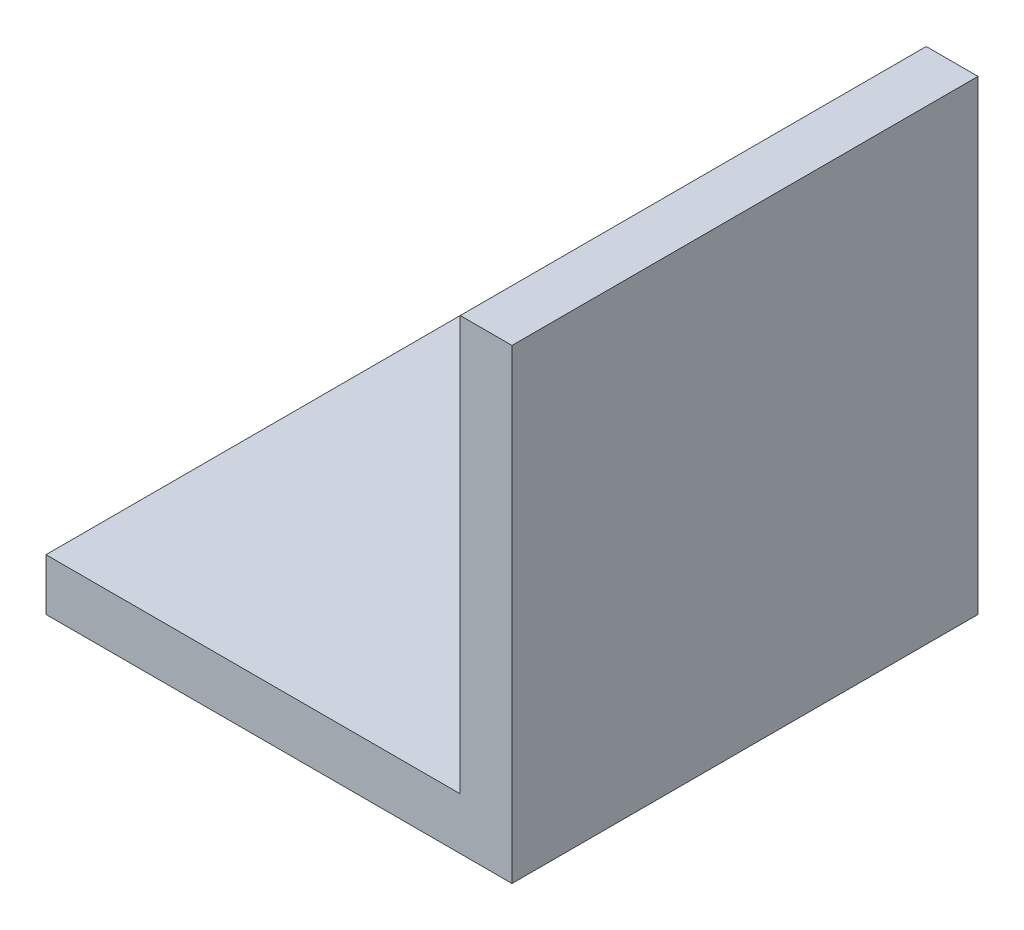
ISO-10303-21;
HEADER;
FILE_DESCRIPTION(('STEP AP214'),'2;1');
FILE_NAME('part.step','',(''),(''),'','','');
FILE_SCHEMA(('AUTOMOTIVE_DESIGN { 1 0 10303 214 1 1 1 1 }'));
ENDSEC;
DATA;
#1=APPLICATION_CONTEXT('core data for automotive mechanical design processes');
#2=APPLICATION_PROTOCOL_DEFINITION('international standard','automotive_design',2000,#1);
#3=PRODUCT_CONTEXT('',#1,'mechanical');
#4=PRODUCT('Part','Part','',(#3));
#5=PRODUCT_RELATED_PRODUCT_CATEGORY('part','',(#4));
#6=PRODUCT_DEFINITION_FORMATION('','',#4);
#7=PRODUCT_DEFINITION_CONTEXT('part definition',#1,'design');
#8=PRODUCT_DEFINITION('design','',#6,#7);
#9=PRODUCT_DEFINITION_SHAPE('','',#8);
#10=(LENGTH_UNIT() NAMED_UNIT(*) SI_UNIT(.MILLI.,.METRE.));
#11=(NAMED_UNIT(*) PLANE_ANGLE_UNIT() SI_UNIT($,.RADIAN.));
#12=(NAMED_UNIT(*) SI_UNIT($,.STERADIAN.) SOLID_ANGLE_UNIT());
#13=UNCERTAINTY_MEASURE_WITH_UNIT(LENGTH_MEASURE(1.E-05),#10,'distance_accuracy_value','');
#14=(GEOMETRIC_REPRESENTATION_CONTEXT(3) GLOBAL_UNCERTAINTY_ASSIGNED_CONTEXT((#13)) GLOBAL_UNIT_ASSIGNED_CONTEXT((#10,
#11,#12)) REPRESENTATION_CONTEXT('',''));
#15=CARTESIAN_POINT('',(0.,0.,0.));
#16=DIRECTION('',(0.,0.,1.));
#17=DIRECTION('',(1.,0.,0.));
#18=AXIS2_PLACEMENT_3D('',#15,#16,#17);
#19=CARTESIAN_POINT('',(-49.4298764435396,8.46666582,37.5879032258064));
#20=DIRECTION('',(1.,0.,0.));
#21=DIRECTION('',(0.,0.,-1.));
#22=AXIS2_PLACEMENT_3D('',#19,#20,#21);
#23=PLANE('',#22);
#24=DIRECTION('',(0.,0.,1.));
#25=VECTOR('',#24,1.);
#26=CARTESIAN_POINT('',(-49.4298764435396,0.,37.5879032258064));
#27=LINE('',#26,#25);
#28=CARTESIAN_POINT('',(-49.4298764435396,0.,-38.6120967741935));
#29=VERTEX_POINT('',#28);
#30=CARTESIAN_POINT('',(-49.4298764435396,0.,37.5879032258064));
#31=VERTEX_POINT('',#30);
#32=EDGE_CURVE('E113',#29,#31,#27,.T.);
#33=ORIENTED_EDGE('',*,*,#32,.T.);
#34=DIRECTION('',(0.,-1.,0.));
#35=VECTOR('',#34,1.);
#36=CARTESIAN_POINT('',(-49.4298764435396,8.46666582,37.5879032258064));
#37=LINE('',#36,#35);
#38=CARTESIAN_POINT('',(-49.4298764435396,8.46666582,37.5879032258064));
#39=VERTEX_POINT('',#38);
#40=EDGE_CURVE('E11',#39,#31,#37,.T.);
#41=ORIENTED_EDGE('',*,*,#40,.F.);
#42=DIRECTION('',(0.,0.,1.));
#43=VECTOR('',#42,1.);
#44=CARTESIAN_POINT('',(-49.4298764435396,8.46666582,37.5879032258064));
#45=LINE('',#44,#43);
#46=CARTESIAN_POINT('',(-49.4298764435396,8.46666582,-38.6120967741935));
#47=VERTEX_POINT('',#46);
#48=EDGE_CURVE('E114',#47,#39,#45,.T.);
#49=ORIENTED_EDGE('',*,*,#48,.F.);
#50=DIRECTION('',(0.,-1.,0.));
#51=VECTOR('',#50,1.);
#52=CARTESIAN_POINT('',(-49.4298764435396,8.46666582,-38.6120967741935));
#53=LINE('',#52,#51);
#54=EDGE_CURVE('E119',#47,#29,#53,.T.);
#55=ORIENTED_EDGE('',*,*,#54,.T.);
#56=EDGE_LOOP('',(#33,#41,#49,#55));
#57=FACE_BOUND('',#56,.T.);
#58=ADVANCED_FACE('F33',(#57),#23,.F.);
#59=CARTESIAN_POINT('',(-49.4298764435396,8.46666582,37.5879032258064));
#60=DIRECTION('',(0.,0.,-1.));
#61=DIRECTION('',(-1.,0.,0.));
#62=AXIS2_PLACEMENT_3D('',#59,#60,#61);
#63=PLANE('',#62);
#64=DIRECTION('',(1.,0.,0.));
#65=VECTOR('',#64,1.);
#66=CARTESIAN_POINT('',(-49.4298764435396,0.,37.5879032258064));
#67=LINE('',#66,#65);
#68=CARTESIAN_POINT('',(26.7701235564604,0.,37.5879032258065));
#69=VERTEX_POINT('',#68);
#70=EDGE_CURVE('E122',#31,#69,#67,.T.);
#71=ORIENTED_EDGE('',*,*,#70,.T.);
#72=DIRECTION('',(0.,-1.,0.));
#73=VECTOR('',#72,1.);
#74=CARTESIAN_POINT('',(26.7701235564604,8.46666582,37.5879032258065));
#75=LINE('',#74,#73);
#76=CARTESIAN_POINT('',(26.7701235564604,76.2,37.5879032258065));
#77=VERTEX_POINT('',#76);
#78=EDGE_CURVE('E40',#77,#69,#75,.T.);
#79=ORIENTED_EDGE('',*,*,#78,.F.);
#80=DIRECTION('',(1.,0.,0.));
#81=VECTOR('',#80,1.);
#82=CARTESIAN_POINT('',(18.3034568897937,76.2,37.5879032258065));
#83=LINE('',#82,#81);
#84=CARTESIAN_POINT('',(18.3034568897937,76.2,37.5879032258065));
#85=VERTEX_POINT('',#84);
#86=EDGE_CURVE('E102',#85,#77,#83,.T.);
#87=ORIENTED_EDGE('',*,*,#86,.F.);
#88=DIRECTION('',(0.,-1.,0.));
#89=VECTOR('',#88,1.);
#90=CARTESIAN_POINT('',(18.3034568897937,0.,37.5879032258065));
#91=LINE('',#90,#89);
#92=CARTESIAN_POINT('',(18.3034568897937,8.46666582,37.5879032258065));
#93=VERTEX_POINT('',#92);
#94=EDGE_CURVE('E94',#85,#93,#91,.T.);
#95=ORIENTED_EDGE('',*,*,#94,.T.);
#96=DIRECTION('',(1.,0.,0.));
#97=VECTOR('',#96,1.);
#98=CARTESIAN_POINT('',(-49.4298764435396,8.46666582,37.5879032258064));
#99=LINE('',#98,#97);
#100=EDGE_CURVE('E52',#39,#93,#99,.T.);
#101=ORIENTED_EDGE('',*,*,#100,.F.);
#102=ORIENTED_EDGE('',*,*,#40,.T.);
#103=EDGE_LOOP('',(#71,#79,#87,#95,#101,#102));
#104=FACE_BOUND('',#103,.T.);
#105=ADVANCED_FACE('F153',(#104),#63,.F.);
#106=CARTESIAN_POINT('',(26.7701235564604,8.46666582,37.5879032258065));
#107=DIRECTION('',(-1.,0.,0.));
#108=DIRECTION('',(0.,0.,1.));
#109=AXIS2_PLACEMENT_3D('',#106,#107,#108);
#110=PLANE('',#109);
#111=DIRECTION('',(0.,0.,-1.));
#112=VECTOR('',#111,1.);
#113=CARTESIAN_POINT('',(26.7701235564604,0.,37.5879032258065));
#114=LINE('',#113,#112);
#115=CARTESIAN_POINT('',(26.7701235564604,0.,-38.6120967741935));
#116=VERTEX_POINT('',#115);
#117=EDGE_CURVE('E124',#69,#116,#114,.T.);
#118=ORIENTED_EDGE('',*,*,#117,.T.);
#119=DIRECTION('',(0.,-1.,0.));
#120=VECTOR('',#119,1.);
#121=CARTESIAN_POINT('',(26.7701235564604,8.46666582,-38.6120967741935));
#122=LINE('',#121,#120);
#123=CARTESIAN_POINT('',(26.7701235564604,76.2,-38.6120967741935));
#124=VERTEX_POINT('',#123);
#125=EDGE_CURVE('E129',#124,#116,#122,.T.);
#126=ORIENTED_EDGE('',*,*,#125,.F.);
#127=DIRECTION('',(0.,0.,1.));
#128=VECTOR('',#127,1.);
#129=CARTESIAN_POINT('',(26.7701235564604,76.2,37.5879032258065));
#130=LINE('',#129,#128);
#131=EDGE_CURVE('E101',#124,#77,#130,.T.);
#132=ORIENTED_EDGE('',*,*,#131,.T.);
#133=ORIENTED_EDGE('',*,*,#78,.T.);
#134=EDGE_LOOP('',(#118,#126,#132,#133));
#135=FACE_BOUND('',#134,.T.);
#136=ADVANCED_FACE('F133',(#135),#110,.F.);
#137=CARTESIAN_POINT('',(-49.4298764435396,8.46666582,-38.6120967741935));
#138=DIRECTION('',(0.,0.,1.));
#139=DIRECTION('',(1.,0.,0.));
#140=AXIS2_PLACEMENT_3D('',#137,#138,#139);
#141=PLANE('',#140);
#142=DIRECTION('',(-1.,0.,0.));
#143=VECTOR('',#142,1.);
#144=CARTESIAN_POINT('',(-49.4298764435396,8.46666582,-38.6120967741935));
#145=LINE('',#144,#143);
#146=CARTESIAN_POINT('',(18.3034568897937,8.46666582,-38.6120967741935));
#147=VERTEX_POINT('',#146);
#148=EDGE_CURVE('E90',#147,#47,#145,.T.);
#149=ORIENTED_EDGE('',*,*,#148,.F.);
#150=DIRECTION('',(0.,1.,0.));
#151=VECTOR('',#150,1.);
#152=CARTESIAN_POINT('',(18.3034568897937,0.,-38.6120967741935));
#153=LINE('',#152,#151);
#154=CARTESIAN_POINT('',(18.3034568897937,76.2,-38.6120967741935));
#155=VERTEX_POINT('',#154);
#156=EDGE_CURVE('E83',#147,#155,#153,.T.);
#157=ORIENTED_EDGE('',*,*,#156,.T.);
#158=DIRECTION('',(1.,0.,0.));
#159=VECTOR('',#158,1.);
#160=CARTESIAN_POINT('',(18.3034568897937,76.2,-38.6120967741935));
#161=LINE('',#160,#159);
#162=EDGE_CURVE('E87',#155,#124,#161,.T.);
#163=ORIENTED_EDGE('',*,*,#162,.T.);
#164=ORIENTED_EDGE('',*,*,#125,.T.);
#165=DIRECTION('',(-1.,0.,0.));
#166=VECTOR('',#165,1.);
#167=CARTESIAN_POINT('',(-49.4298764435396,0.,-38.6120967741935));
#168=LINE('',#167,#166);
#169=EDGE_CURVE('E116',#116,#29,#168,.T.);
#170=ORIENTED_EDGE('',*,*,#169,.T.);
#171=ORIENTED_EDGE('',*,*,#54,.F.);
#172=EDGE_LOOP('',(#149,#157,#163,#164,#170,#171));
#173=FACE_BOUND('',#172,.T.);
#174=ADVANCED_FACE('F85',(#173),#141,.F.);
#175=CARTESIAN_POINT('',(0.,8.46666582,0.));
#176=DIRECTION('',(0.,-1.,0.));
#177=DIRECTION('',(0.,0.,-1.));
#178=AXIS2_PLACEMENT_3D('',#175,#176,#177);
#179=PLANE('',#178);
#180=ORIENTED_EDGE('',*,*,#100,.T.);
#181=DIRECTION('',(0.,0.,-1.));
#182=VECTOR('',#181,1.);
#183=CARTESIAN_POINT('',(18.3034568897937,8.46666582,0.));
#184=LINE('',#183,#182);
#185=EDGE_CURVE('E47',#93,#147,#184,.T.);
#186=ORIENTED_EDGE('',*,*,#185,.T.);
#187=ORIENTED_EDGE('',*,*,#148,.T.);
#188=ORIENTED_EDGE('',*,*,#48,.T.);
#189=EDGE_LOOP('',(#180,#186,#187,#188));
#190=FACE_BOUND('',#189,.T.);
#191=ADVANCED_FACE('F142',(#190),#179,.F.);
#192=CARTESIAN_POINT('',(0.,0.,0.));
#193=DIRECTION('',(0.,-1.,0.));
#194=DIRECTION('',(0.,0.,-1.));
#195=AXIS2_PLACEMENT_3D('',#192,#193,#194);
#196=PLANE('',#195);
#197=ORIENTED_EDGE('',*,*,#32,.F.);
#198=ORIENTED_EDGE('',*,*,#169,.F.);
#199=ORIENTED_EDGE('',*,*,#117,.F.);
#200=ORIENTED_EDGE('',*,*,#70,.F.);
#201=EDGE_LOOP('',(#197,#198,#199,#200));
#202=FACE_BOUND('',#201,.T.);
#203=ADVANCED_FACE('F138',(#202),#196,.T.);
#204=CARTESIAN_POINT('',(18.3034568897937,0.,0.));
#205=DIRECTION('',(-1.,0.,0.));
#206=DIRECTION('',(0.,0.,1.));
#207=AXIS2_PLACEMENT_3D('',#204,#205,#206);
#208=PLANE('',#207);
#209=ORIENTED_EDGE('',*,*,#185,.F.);
#210=ORIENTED_EDGE('',*,*,#94,.F.);
#211=DIRECTION('',(0.,0.,1.));
#212=VECTOR('',#211,1.);
#213=CARTESIAN_POINT('',(18.3034568897937,76.2,37.5879032258065));
#214=LINE('',#213,#212);
#215=EDGE_CURVE('E93',#155,#85,#214,.T.);
#216=ORIENTED_EDGE('',*,*,#215,.F.);
#217=ORIENTED_EDGE('',*,*,#156,.F.);
#218=EDGE_LOOP('',(#209,#210,#216,#217));
#219=FACE_BOUND('',#218,.T.);
#220=ADVANCED_FACE('F105',(#219),#208,.T.);
#221=CARTESIAN_POINT('',(18.3034568897937,76.2,37.5879032258065));
#222=DIRECTION('',(0.,1.,0.));
#223=DIRECTION('',(0.,0.,1.));
#224=AXIS2_PLACEMENT_3D('',#221,#222,#223);
#225=PLANE('',#224);
#226=ORIENTED_EDGE('',*,*,#131,.F.);
#227=ORIENTED_EDGE('',*,*,#162,.F.);
#228=ORIENTED_EDGE('',*,*,#215,.T.);
#229=ORIENTED_EDGE('',*,*,#86,.T.);
#230=EDGE_LOOP('',(#226,#227,#228,#229));
#231=FACE_BOUND('',#230,.T.);
#232=ADVANCED_FACE('F98',(#231),#225,.T.);
#233=CLOSED_SHELL('',(#58,#105,#136,#174,#191,#203,#220,#232));
#234=MANIFOLD_SOLID_BREP('B2',#233);
#235=ADVANCED_BREP_SHAPE_REPRESENTATION('',(#18,#234),#14);
#236=SHAPE_DEFINITION_REPRESENTATION(#9,#235);
ENDSEC;
END-ISO-10303-21;
